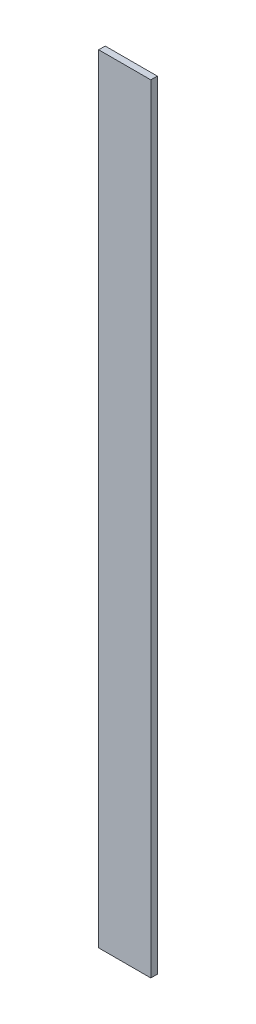
ISO-10303-21;
HEADER;
FILE_DESCRIPTION(('STEP AP214'),'2;1');
FILE_NAME('part.step','',(''),(''),'','','');
FILE_SCHEMA(('AUTOMOTIVE_DESIGN { 1 0 10303 214 1 1 1 1 }'));
ENDSEC;
DATA;
#1=APPLICATION_CONTEXT('core data for automotive mechanical design processes');
#2=APPLICATION_PROTOCOL_DEFINITION('international standard','automotive_design',2000,#1);
#3=PRODUCT_CONTEXT('',#1,'mechanical');
#4=PRODUCT('Part','Part','',(#3));
#5=PRODUCT_RELATED_PRODUCT_CATEGORY('part','',(#4));
#6=PRODUCT_DEFINITION_FORMATION('','',#4);
#7=PRODUCT_DEFINITION_CONTEXT('part definition',#1,'design');
#8=PRODUCT_DEFINITION('design','',#6,#7);
#9=PRODUCT_DEFINITION_SHAPE('','',#8);
#10=(LENGTH_UNIT() NAMED_UNIT(*) SI_UNIT(.MILLI.,.METRE.));
#11=(NAMED_UNIT(*) PLANE_ANGLE_UNIT() SI_UNIT($,.RADIAN.));
#12=(NAMED_UNIT(*) SI_UNIT($,.STERADIAN.) SOLID_ANGLE_UNIT());
#13=UNCERTAINTY_MEASURE_WITH_UNIT(LENGTH_MEASURE(1.E-05),#10,'distance_accuracy_value','');
#14=(GEOMETRIC_REPRESENTATION_CONTEXT(3) GLOBAL_UNCERTAINTY_ASSIGNED_CONTEXT((#13)) GLOBAL_UNIT_ASSIGNED_CONTEXT((#10,
#11,#12)) REPRESENTATION_CONTEXT('',''));
#15=CARTESIAN_POINT('',(0.,0.,0.));
#16=DIRECTION('',(0.,0.,1.));
#17=DIRECTION('',(1.,0.,0.));
#18=AXIS2_PLACEMENT_3D('',#15,#16,#17);
#19=CARTESIAN_POINT('',(702.,1469.,40.));
#20=DIRECTION('',(1.,0.,0.));
#21=DIRECTION('',(0.,0.,-1.));
#22=AXIS2_PLACEMENT_3D('',#19,#20,#21);
#23=PLANE('',#22);
#24=DIRECTION('',(0.,-1.,0.));
#25=VECTOR('',#24,1.);
#26=CARTESIAN_POINT('',(702.,1469.,38.5));
#27=LINE('',#26,#25);
#28=CARTESIAN_POINT('',(702.,1648.,38.5));
#29=VERTEX_POINT('',#28);
#30=CARTESIAN_POINT('',(702.,1469.,38.5));
#31=VERTEX_POINT('',#30);
#32=EDGE_CURVE('E102',#29,#31,#27,.T.);
#33=ORIENTED_EDGE('',*,*,#32,.T.);
#34=DIRECTION('',(0.,0.,-1.));
#35=VECTOR('',#34,1.);
#36=CARTESIAN_POINT('',(702.,1469.,40.));
#37=LINE('',#36,#35);
#38=CARTESIAN_POINT('',(702.,1469.,40.));
#39=VERTEX_POINT('',#38);
#40=EDGE_CURVE('E11',#39,#31,#37,.T.);
#41=ORIENTED_EDGE('',*,*,#40,.F.);
#42=DIRECTION('',(0.,-1.,0.));
#43=VECTOR('',#42,1.);
#44=CARTESIAN_POINT('',(702.,1469.,40.));
#45=LINE('',#44,#43);
#46=CARTESIAN_POINT('',(702.,1648.,40.));
#47=VERTEX_POINT('',#46);
#48=EDGE_CURVE('E90',#47,#39,#45,.T.);
#49=ORIENTED_EDGE('',*,*,#48,.F.);
#50=DIRECTION('',(0.,0.,-1.));
#51=VECTOR('',#50,1.);
#52=CARTESIAN_POINT('',(702.,1648.,40.));
#53=LINE('',#52,#51);
#54=EDGE_CURVE('E98',#47,#29,#53,.T.);
#55=ORIENTED_EDGE('',*,*,#54,.T.);
#56=EDGE_LOOP('',(#33,#41,#49,#55));
#57=FACE_BOUND('',#56,.T.);
#58=ADVANCED_FACE('F39',(#57),#23,.F.);
#59=CARTESIAN_POINT('',(702.,1469.,40.));
#60=DIRECTION('',(0.,1.,0.));
#61=DIRECTION('',(0.,0.,1.));
#62=AXIS2_PLACEMENT_3D('',#59,#60,#61);
#63=PLANE('',#62);
#64=DIRECTION('',(1.,0.,0.));
#65=VECTOR('',#64,1.);
#66=CARTESIAN_POINT('',(702.,1469.,38.5));
#67=LINE('',#66,#65);
#68=CARTESIAN_POINT('',(714.,1469.,38.5));
#69=VERTEX_POINT('',#68);
#70=EDGE_CURVE('E94',#31,#69,#67,.T.);
#71=ORIENTED_EDGE('',*,*,#70,.T.);
#72=DIRECTION('',(0.,0.,-1.));
#73=VECTOR('',#72,1.);
#74=CARTESIAN_POINT('',(714.,1469.,40.));
#75=LINE('',#74,#73);
#76=CARTESIAN_POINT('',(714.,1469.,40.));
#77=VERTEX_POINT('',#76);
#78=EDGE_CURVE('E47',#77,#69,#75,.T.);
#79=ORIENTED_EDGE('',*,*,#78,.F.);
#80=DIRECTION('',(1.,0.,0.));
#81=VECTOR('',#80,1.);
#82=CARTESIAN_POINT('',(702.,1469.,40.));
#83=LINE('',#82,#81);
#84=EDGE_CURVE('E85',#39,#77,#83,.T.);
#85=ORIENTED_EDGE('',*,*,#84,.F.);
#86=ORIENTED_EDGE('',*,*,#40,.T.);
#87=EDGE_LOOP('',(#71,#79,#85,#86));
#88=FACE_BOUND('',#87,.T.);
#89=ADVANCED_FACE('F93',(#88),#63,.F.);
#90=CARTESIAN_POINT('',(714.,1469.,40.));
#91=DIRECTION('',(-1.,0.,0.));
#92=DIRECTION('',(0.,0.,1.));
#93=AXIS2_PLACEMENT_3D('',#90,#91,#92);
#94=PLANE('',#93);
#95=DIRECTION('',(0.,1.,0.));
#96=VECTOR('',#95,1.);
#97=CARTESIAN_POINT('',(714.,1469.,38.5));
#98=LINE('',#97,#96);
#99=CARTESIAN_POINT('',(714.,1648.,38.5));
#100=VERTEX_POINT('',#99);
#101=EDGE_CURVE('E72',#69,#100,#98,.T.);
#102=ORIENTED_EDGE('',*,*,#101,.T.);
#103=DIRECTION('',(0.,0.,-1.));
#104=VECTOR('',#103,1.);
#105=CARTESIAN_POINT('',(714.,1648.,40.));
#106=LINE('',#105,#104);
#107=CARTESIAN_POINT('',(714.,1648.,40.));
#108=VERTEX_POINT('',#107);
#109=EDGE_CURVE('E95',#108,#100,#106,.T.);
#110=ORIENTED_EDGE('',*,*,#109,.F.);
#111=DIRECTION('',(0.,1.,0.));
#112=VECTOR('',#111,1.);
#113=CARTESIAN_POINT('',(714.,1469.,40.));
#114=LINE('',#113,#112);
#115=EDGE_CURVE('E88',#77,#108,#114,.T.);
#116=ORIENTED_EDGE('',*,*,#115,.F.);
#117=ORIENTED_EDGE('',*,*,#78,.T.);
#118=EDGE_LOOP('',(#102,#110,#116,#117));
#119=FACE_BOUND('',#118,.T.);
#120=ADVANCED_FACE('F96',(#119),#94,.F.);
#121=CARTESIAN_POINT('',(702.,1648.,40.));
#122=DIRECTION('',(0.,-1.,0.));
#123=DIRECTION('',(0.,0.,-1.));
#124=AXIS2_PLACEMENT_3D('',#121,#122,#123);
#125=PLANE('',#124);
#126=DIRECTION('',(-1.,0.,0.));
#127=VECTOR('',#126,1.);
#128=CARTESIAN_POINT('',(702.,1648.,38.5));
#129=LINE('',#128,#127);
#130=EDGE_CURVE('E78',#100,#29,#129,.T.);
#131=ORIENTED_EDGE('',*,*,#130,.T.);
#132=ORIENTED_EDGE('',*,*,#54,.F.);
#133=DIRECTION('',(-1.,0.,0.));
#134=VECTOR('',#133,1.);
#135=CARTESIAN_POINT('',(702.,1648.,40.));
#136=LINE('',#135,#134);
#137=EDGE_CURVE('E55',#108,#47,#136,.T.);
#138=ORIENTED_EDGE('',*,*,#137,.F.);
#139=ORIENTED_EDGE('',*,*,#109,.T.);
#140=EDGE_LOOP('',(#131,#132,#138,#139));
#141=FACE_BOUND('',#140,.T.);
#142=ADVANCED_FACE('F109',(#141),#125,.F.);
#143=CARTESIAN_POINT('',(0.,0.,40.));
#144=DIRECTION('',(0.,0.,-1.));
#145=DIRECTION('',(-1.,0.,0.));
#146=AXIS2_PLACEMENT_3D('',#143,#144,#145);
#147=PLANE('',#146);
#148=ORIENTED_EDGE('',*,*,#48,.T.);
#149=ORIENTED_EDGE('',*,*,#84,.T.);
#150=ORIENTED_EDGE('',*,*,#115,.T.);
#151=ORIENTED_EDGE('',*,*,#137,.T.);
#152=EDGE_LOOP('',(#148,#149,#150,#151));
#153=FACE_BOUND('',#152,.T.);
#154=ADVANCED_FACE('F86',(#153),#147,.F.);
#155=CARTESIAN_POINT('',(0.,0.,38.5));
#156=DIRECTION('',(0.,0.,-1.));
#157=DIRECTION('',(-1.,0.,0.));
#158=AXIS2_PLACEMENT_3D('',#155,#156,#157);
#159=PLANE('',#158);
#160=ORIENTED_EDGE('',*,*,#32,.F.);
#161=ORIENTED_EDGE('',*,*,#130,.F.);
#162=ORIENTED_EDGE('',*,*,#101,.F.);
#163=ORIENTED_EDGE('',*,*,#70,.F.);
#164=EDGE_LOOP('',(#160,#161,#162,#163));
#165=FACE_BOUND('',#164,.T.);
#166=ADVANCED_FACE('F112',(#165),#159,.T.);
#167=CLOSED_SHELL('',(#58,#89,#120,#142,#154,#166));
#168=MANIFOLD_SOLID_BREP('B2',#167);
#169=ADVANCED_BREP_SHAPE_REPRESENTATION('',(#18,#168),#14);
#170=SHAPE_DEFINITION_REPRESENTATION(#9,#169);
ENDSEC;
END-ISO-10303-21;
